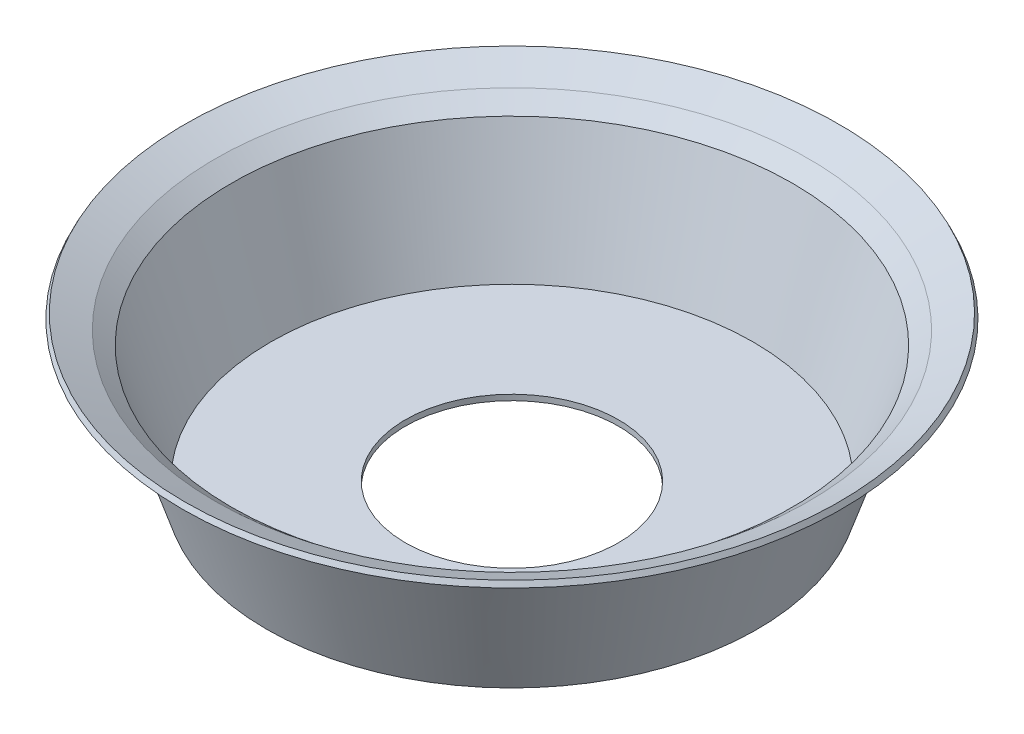
ISO-10303-21;
HEADER;
FILE_DESCRIPTION(('STEP AP214'),'2;1');
FILE_NAME('part.step','',(''),(''),'','','');
FILE_SCHEMA(('AUTOMOTIVE_DESIGN { 1 0 10303 214 1 1 1 1 }'));
ENDSEC;
DATA;
#1=APPLICATION_CONTEXT('core data for automotive mechanical design processes');
#2=APPLICATION_PROTOCOL_DEFINITION('international standard','automotive_design',2000,#1);
#3=PRODUCT_CONTEXT('',#1,'mechanical');
#4=PRODUCT('Part','Part','',(#3));
#5=PRODUCT_RELATED_PRODUCT_CATEGORY('part','',(#4));
#6=PRODUCT_DEFINITION_FORMATION('','',#4);
#7=PRODUCT_DEFINITION_CONTEXT('part definition',#1,'design');
#8=PRODUCT_DEFINITION('design','',#6,#7);
#9=PRODUCT_DEFINITION_SHAPE('','',#8);
#10=(LENGTH_UNIT() NAMED_UNIT(*) SI_UNIT(.MILLI.,.METRE.));
#11=(NAMED_UNIT(*) PLANE_ANGLE_UNIT() SI_UNIT($,.RADIAN.));
#12=(NAMED_UNIT(*) SI_UNIT($,.STERADIAN.) SOLID_ANGLE_UNIT());
#13=UNCERTAINTY_MEASURE_WITH_UNIT(LENGTH_MEASURE(1.E-05),#10,'distance_accuracy_value','');
#14=(GEOMETRIC_REPRESENTATION_CONTEXT(3) GLOBAL_UNCERTAINTY_ASSIGNED_CONTEXT((#13)) GLOBAL_UNIT_ASSIGNED_CONTEXT((#10,
#11,#12)) REPRESENTATION_CONTEXT('',''));
#15=CARTESIAN_POINT('',(0.,0.,0.));
#16=DIRECTION('',(0.,0.,1.));
#17=DIRECTION('',(1.,0.,0.));
#18=AXIS2_PLACEMENT_3D('',#15,#16,#17);
#19=CARTESIAN_POINT('',(0.,22.482072549379,0.));
#20=DIRECTION('',(0.,1.,0.));
#21=DIRECTION('',(0.,0.,1.));
#22=AXIS2_PLACEMENT_3D('',#19,#20,#21);
#23=CONICAL_SURFACE('',#22,53.4284746095807,1.11990759501973);
#24=CARTESIAN_POINT('',(0.,25.052946122985,0.));
#25=DIRECTION('',(0.,1.,0.));
#26=DIRECTION('',(0.,0.,1.));
#27=AXIS2_PLACEMENT_3D('',#24,#25,#26);
#28=CIRCLE('',#27,58.738533119433);
#29=CARTESIAN_POINT('',(0.,25.052946122985,58.738533119433));
#30=VERTEX_POINT('',#29);
#31=EDGE_CURVE('E65',#30,#30,#28,.T.);
#32=ORIENTED_EDGE('',*,*,#31,.F.);
#33=EDGE_LOOP('',(#32));
#34=FACE_BOUND('',#33,.T.);
#35=CARTESIAN_POINT('',(0.,22.482072549379,0.));
#36=DIRECTION('',(0.,1.,0.));
#37=DIRECTION('',(0.,0.,1.));
#38=AXIS2_PLACEMENT_3D('',#35,#36,#37);
#39=CIRCLE('',#38,53.4284746095807);
#40=CARTESIAN_POINT('',(0.,22.482072549379,53.4284746095807));
#41=VERTEX_POINT('',#40);
#42=EDGE_CURVE('E10',#41,#41,#39,.T.);
#43=ORIENTED_EDGE('',*,*,#42,.T.);
#44=EDGE_LOOP('',(#43));
#45=FACE_BOUND('',#44,.T.);
#46=ADVANCED_FACE('F31',(#34,#45),#23,.T.);
#47=CARTESIAN_POINT('',(0.,20.4058385928895,0.));
#48=DIRECTION('',(0.,1.,0.));
#49=DIRECTION('',(0.,0.,1.));
#50=AXIS2_PLACEMENT_3D('',#47,#48,#49);
#51=CONICAL_SURFACE('',#50,50.8560387510196,0.891736147908962);
#52=ORIENTED_EDGE('',*,*,#42,.F.);
#53=EDGE_LOOP('',(#52));
#54=FACE_BOUND('',#53,.T.);
#55=CARTESIAN_POINT('',(0.,20.4058385928895,0.));
#56=DIRECTION('',(0.,1.,0.));
#57=DIRECTION('',(0.,0.,1.));
#58=AXIS2_PLACEMENT_3D('',#55,#56,#57);
#59=CIRCLE('',#58,50.8560387510196);
#60=CARTESIAN_POINT('',(0.,20.4058385928895,50.8560387510196));
#61=VERTEX_POINT('',#60);
#62=EDGE_CURVE('E37',#61,#61,#59,.T.);
#63=ORIENTED_EDGE('',*,*,#62,.T.);
#64=EDGE_LOOP('',(#63));
#65=FACE_BOUND('',#64,.T.);
#66=ADVANCED_FACE('F73',(#54,#65),#51,.T.);
#67=CARTESIAN_POINT('',(0.,-1.00000000000821,0.));
#68=DIRECTION('',(0.,1.,0.));
#69=DIRECTION('',(0.,0.,1.));
#70=AXIS2_PLACEMENT_3D('',#67,#68,#69);
#71=CONICAL_SURFACE('',#70,43.7207592200747,0.321750554395756);
#72=ORIENTED_EDGE('',*,*,#62,.F.);
#73=EDGE_LOOP('',(#72));
#74=FACE_BOUND('',#73,.T.);
#75=CARTESIAN_POINT('',(0.,-1.00000000000821,0.));
#76=DIRECTION('',(0.,1.,0.));
#77=DIRECTION('',(0.,0.,1.));
#78=AXIS2_PLACEMENT_3D('',#75,#76,#77);
#79=CIRCLE('',#78,43.7207592200747);
#80=CARTESIAN_POINT('',(0.,-1.00000000000821,43.7207592200747));
#81=VERTEX_POINT('',#80);
#82=EDGE_CURVE('E41',#81,#81,#79,.T.);
#83=ORIENTED_EDGE('',*,*,#82,.T.);
#84=EDGE_LOOP('',(#83));
#85=FACE_BOUND('',#84,.T.);
#86=ADVANCED_FACE('F77',(#74,#85),#71,.T.);
#87=CARTESIAN_POINT('',(19.0000000000179,-1.00000000000821,0.));
#88=DIRECTION('',(0.,1.,0.));
#89=DIRECTION('',(0.,0.,1.));
#90=AXIS2_PLACEMENT_3D('',#87,#88,#89);
#91=PLANE('',#90);
#92=ORIENTED_EDGE('',*,*,#82,.F.);
#93=EDGE_LOOP('',(#92));
#94=FACE_BOUND('',#93,.T.);
#95=CARTESIAN_POINT('',(0.,-1.00000000000821,0.));
#96=DIRECTION('',(0.,1.,0.));
#97=DIRECTION('',(0.,0.,1.));
#98=AXIS2_PLACEMENT_3D('',#95,#96,#97);
#99=CIRCLE('',#98,19.0000000000179);
#100=CARTESIAN_POINT('',(0.,-1.00000000000821,19.0000000000179));
#101=VERTEX_POINT('',#100);
#102=EDGE_CURVE('E45',#101,#101,#99,.T.);
#103=ORIENTED_EDGE('',*,*,#102,.T.);
#104=EDGE_LOOP('',(#103));
#105=FACE_BOUND('',#104,.T.);
#106=ADVANCED_FACE('F82',(#94,#105),#91,.F.);
#107=CARTESIAN_POINT('',(0.,0.,0.));
#108=DIRECTION('',(0.,1.,0.));
#109=DIRECTION('',(0.,0.,1.));
#110=AXIS2_PLACEMENT_3D('',#107,#108,#109);
#111=CYLINDRICAL_SURFACE('',#110,19.0000000000179);
#112=CARTESIAN_POINT('',(0.,-8.20985384275657E-12,0.));
#113=DIRECTION('',(0.,1.,0.));
#114=DIRECTION('',(0.,0.,1.));
#115=AXIS2_PLACEMENT_3D('',#112,#113,#114);
#116=CIRCLE('',#115,19.0000000000179);
#117=CARTESIAN_POINT('',(0.,-8.20985384275657E-12,19.0000000000179));
#118=VERTEX_POINT('',#117);
#119=EDGE_CURVE('E50',#118,#118,#116,.T.);
#120=ORIENTED_EDGE('',*,*,#119,.T.);
#121=EDGE_LOOP('',(#120));
#122=FACE_BOUND('',#121,.T.);
#123=ORIENTED_EDGE('',*,*,#102,.F.);
#124=EDGE_LOOP('',(#123));
#125=FACE_BOUND('',#124,.T.);
#126=ADVANCED_FACE('F88',(#122,#125),#111,.F.);
#127=CARTESIAN_POINT('',(19.0000000000179,-8.20985384275657E-12,0.));
#128=DIRECTION('',(0.,1.,0.));
#129=DIRECTION('',(0.,0.,1.));
#130=AXIS2_PLACEMENT_3D('',#127,#128,#129);
#131=PLANE('',#130);
#132=CARTESIAN_POINT('',(0.,-8.20985384275657E-12,0.));
#133=DIRECTION('',(0.,1.,0.));
#134=DIRECTION('',(0.,0.,1.));
#135=AXIS2_PLACEMENT_3D('',#132,#133,#134);
#136=CIRCLE('',#135,43.0000000000179);
#137=CARTESIAN_POINT('',(0.,-8.20985384275657E-12,43.0000000000179));
#138=VERTEX_POINT('',#137);
#139=EDGE_CURVE('E53',#138,#138,#136,.T.);
#140=ORIENTED_EDGE('',*,*,#139,.T.);
#141=EDGE_LOOP('',(#140));
#142=FACE_BOUND('',#141,.T.);
#143=ORIENTED_EDGE('',*,*,#119,.F.);
#144=EDGE_LOOP('',(#143));
#145=FACE_BOUND('',#144,.T.);
#146=ADVANCED_FACE('F92',(#142,#145),#131,.T.);
#147=CARTESIAN_POINT('',(0.,-8.20985384275657E-12,0.));
#148=DIRECTION('',(0.,1.,0.));
#149=DIRECTION('',(0.,0.,1.));
#150=AXIS2_PLACEMENT_3D('',#147,#148,#149);
#151=CONICAL_SURFACE('',#150,43.0000000000179,0.321750554395756);
#152=CARTESIAN_POINT('',(0.,21.,0.));
#153=DIRECTION('',(0.,1.,0.));
#154=DIRECTION('',(0.,0.,1.));
#155=AXIS2_PLACEMENT_3D('',#152,#153,#154);
#156=CIRCLE('',#155,50.);
#157=CARTESIAN_POINT('',(0.,21.,50.));
#158=VERTEX_POINT('',#157);
#159=EDGE_CURVE('E56',#158,#158,#156,.T.);
#160=ORIENTED_EDGE('',*,*,#159,.T.);
#161=EDGE_LOOP('',(#160));
#162=FACE_BOUND('',#161,.T.);
#163=ORIENTED_EDGE('',*,*,#139,.F.);
#164=EDGE_LOOP('',(#163));
#165=FACE_BOUND('',#164,.T.);
#166=ADVANCED_FACE('F96',(#162,#165),#151,.F.);
#167=CARTESIAN_POINT('',(0.,21.,0.));
#168=DIRECTION('',(0.,1.,0.));
#169=DIRECTION('',(0.,0.,1.));
#170=AXIS2_PLACEMENT_3D('',#167,#168,#169);
#171=CONICAL_SURFACE('',#170,50.,0.891736147908962);
#172=CARTESIAN_POINT('',(0.,23.332201275954,0.));
#173=DIRECTION('',(0.,1.,0.));
#174=DIRECTION('',(0.,0.,1.));
#175=AXIS2_PLACEMENT_3D('',#172,#173,#174);
#176=CIRCLE('',#175,52.8895771465901);
#177=CARTESIAN_POINT('',(0.,23.332201275954,52.8895771465901));
#178=VERTEX_POINT('',#177);
#179=EDGE_CURVE('E59',#178,#178,#176,.T.);
#180=ORIENTED_EDGE('',*,*,#179,.T.);
#181=EDGE_LOOP('',(#180));
#182=FACE_BOUND('',#181,.T.);
#183=ORIENTED_EDGE('',*,*,#159,.F.);
#184=EDGE_LOOP('',(#183));
#185=FACE_BOUND('',#184,.T.);
#186=ADVANCED_FACE('F100',(#182,#185),#171,.F.);
#187=CARTESIAN_POINT('',(0.,23.332201275954,0.));
#188=DIRECTION('',(0.,1.,0.));
#189=DIRECTION('',(0.,0.,1.));
#190=AXIS2_PLACEMENT_3D('',#187,#188,#189);
#191=CONICAL_SURFACE('',#190,52.8895771465901,1.11990759501973);
#192=CARTESIAN_POINT('',(0.,25.9530063020908,0.));
#193=DIRECTION('',(0.,1.,0.));
#194=DIRECTION('',(0.,0.,1.));
#195=AXIS2_PLACEMENT_3D('',#192,#193,#194);
#196=CIRCLE('',#195,58.3027675012528);
#197=CARTESIAN_POINT('',(0.,25.9530063020908,58.3027675012528));
#198=VERTEX_POINT('',#197);
#199=EDGE_CURVE('E62',#198,#198,#196,.T.);
#200=ORIENTED_EDGE('',*,*,#199,.T.);
#201=EDGE_LOOP('',(#200));
#202=FACE_BOUND('',#201,.T.);
#203=ORIENTED_EDGE('',*,*,#179,.F.);
#204=EDGE_LOOP('',(#203));
#205=FACE_BOUND('',#204,.T.);
#206=ADVANCED_FACE('F104',(#202,#205),#191,.F.);
#207=CARTESIAN_POINT('',(0.,25.9530063020908,0.));
#208=DIRECTION('',(0.,-1.,0.));
#209=DIRECTION('',(0.,0.,-1.));
#210=AXIS2_PLACEMENT_3D('',#207,#208,#209);
#211=CONICAL_SURFACE('',#210,58.3027675012528,0.450888731775172);
#212=ORIENTED_EDGE('',*,*,#31,.T.);
#213=EDGE_LOOP('',(#212));
#214=FACE_BOUND('',#213,.T.);
#215=ORIENTED_EDGE('',*,*,#199,.F.);
#216=EDGE_LOOP('',(#215));
#217=FACE_BOUND('',#216,.T.);
#218=ADVANCED_FACE('F69',(#214,#217),#211,.T.);
#219=CLOSED_SHELL('',(#46,#66,#86,#106,#126,#146,#166,#186,#206,#218));
#220=MANIFOLD_SOLID_BREP('B2',#219);
#221=ADVANCED_BREP_SHAPE_REPRESENTATION('',(#18,#220),#14);
#222=SHAPE_DEFINITION_REPRESENTATION(#9,#221);
ENDSEC;
END-ISO-10303-21;
